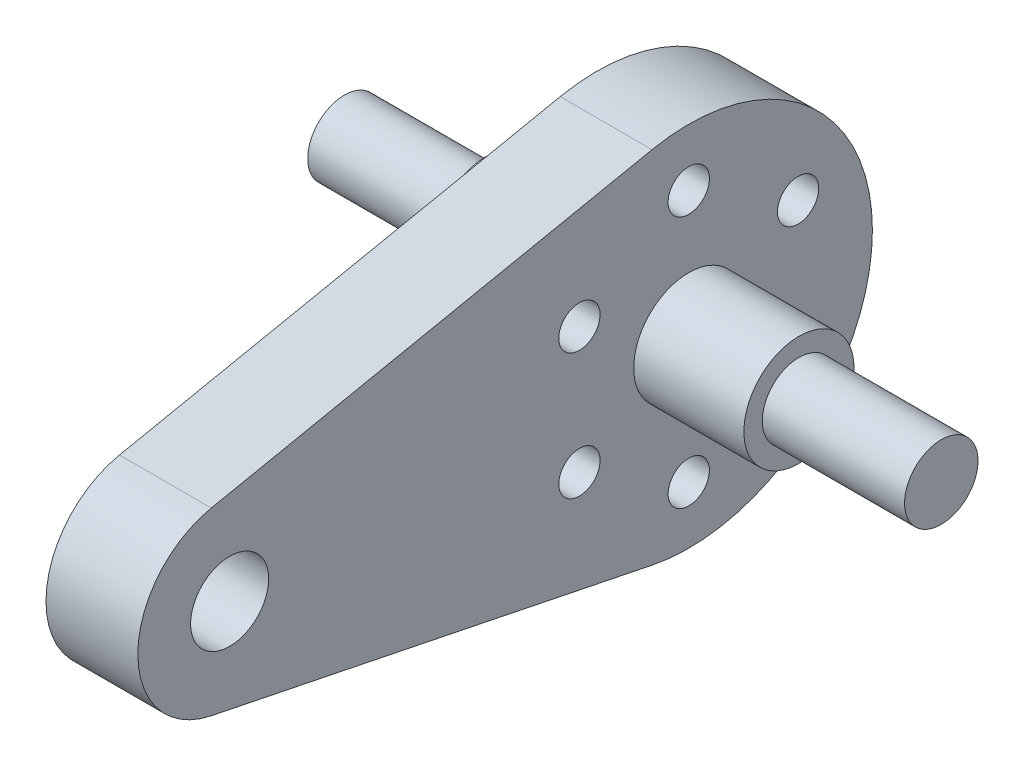
ISO-10303-21;
HEADER;
FILE_DESCRIPTION(('STEP AP214'),'2;1');
FILE_NAME('part.step','',(''),(''),'','','');
FILE_SCHEMA(('AUTOMOTIVE_DESIGN { 1 0 10303 214 1 1 1 1 }'));
ENDSEC;
DATA;
#1=APPLICATION_CONTEXT('core data for automotive mechanical design processes');
#2=APPLICATION_PROTOCOL_DEFINITION('international standard','automotive_design',2000,#1);
#3=PRODUCT_CONTEXT('',#1,'mechanical');
#4=PRODUCT('Part','Part','',(#3));
#5=PRODUCT_RELATED_PRODUCT_CATEGORY('part','',(#4));
#6=PRODUCT_DEFINITION_FORMATION('','',#4);
#7=PRODUCT_DEFINITION_CONTEXT('part definition',#1,'design');
#8=PRODUCT_DEFINITION('design','',#6,#7);
#9=PRODUCT_DEFINITION_SHAPE('','',#8);
#10=(LENGTH_UNIT() NAMED_UNIT(*) SI_UNIT(.MILLI.,.METRE.));
#11=(NAMED_UNIT(*) PLANE_ANGLE_UNIT() SI_UNIT($,.RADIAN.));
#12=(NAMED_UNIT(*) SI_UNIT($,.STERADIAN.) SOLID_ANGLE_UNIT());
#13=UNCERTAINTY_MEASURE_WITH_UNIT(LENGTH_MEASURE(1.E-05),#10,'distance_accuracy_value','');
#14=(GEOMETRIC_REPRESENTATION_CONTEXT(3) GLOBAL_UNCERTAINTY_ASSIGNED_CONTEXT((#13)) GLOBAL_UNIT_ASSIGNED_CONTEXT((#10,
#11,#12)) REPRESENTATION_CONTEXT('',''));
#15=CARTESIAN_POINT('',(0.,0.,0.));
#16=DIRECTION('',(0.,0.,1.));
#17=DIRECTION('',(1.,0.,0.));
#18=AXIS2_PLACEMENT_3D('',#15,#16,#17);
#19=CARTESIAN_POINT('',(32.5,0.,0.));
#20=DIRECTION('',(1.,0.,0.));
#21=DIRECTION('',(0.,0.,-1.));
#22=AXIS2_PLACEMENT_3D('',#19,#20,#21);
#23=CYLINDRICAL_SURFACE('',#22,20.);
#24=CARTESIAN_POINT('',(4.99999999999999,0.,0.));
#25=DIRECTION('',(1.,0.,0.));
#26=DIRECTION('',(0.,0.,-1.));
#27=AXIS2_PLACEMENT_3D('',#24,#25,#26);
#28=CIRCLE('',#27,20.);
#29=CARTESIAN_POINT('',(4.99999999999999,-19.5959179422654,4.));
#30=VERTEX_POINT('',#29);
#31=CARTESIAN_POINT('',(4.99999999999999,19.5959179422654,4.));
#32=VERTEX_POINT('',#31);
#33=EDGE_CURVE('E11',#30,#32,#28,.T.);
#34=ORIENTED_EDGE('',*,*,#33,.F.);
#35=DIRECTION('',(-1.,0.,0.));
#36=VECTOR('',#35,1.);
#37=CARTESIAN_POINT('',(5.,-19.5959179422654,4.00000000000001));
#38=LINE('',#37,#36);
#39=CARTESIAN_POINT('',(-5.,-19.5959179422654,4.));
#40=VERTEX_POINT('',#39);
#41=EDGE_CURVE('E83',#30,#40,#38,.T.);
#42=ORIENTED_EDGE('',*,*,#41,.T.);
#43=CARTESIAN_POINT('',(-5.,0.,0.));
#44=DIRECTION('',(1.,0.,0.));
#45=DIRECTION('',(0.,0.,-1.));
#46=AXIS2_PLACEMENT_3D('',#43,#44,#45);
#47=CIRCLE('',#46,20.);
#48=CARTESIAN_POINT('',(-5.,19.5959179422654,4.));
#49=VERTEX_POINT('',#48);
#50=EDGE_CURVE('E47',#40,#49,#47,.T.);
#51=ORIENTED_EDGE('',*,*,#50,.T.);
#52=DIRECTION('',(-1.,0.,0.));
#53=VECTOR('',#52,1.);
#54=CARTESIAN_POINT('',(5.,19.5959179422654,4.));
#55=LINE('',#54,#53);
#56=EDGE_CURVE('E57',#32,#49,#55,.T.);
#57=ORIENTED_EDGE('',*,*,#56,.F.);
#58=EDGE_LOOP('',(#34,#42,#51,#57));
#59=FACE_BOUND('',#58,.T.);
#60=ADVANCED_FACE('F39',(#59),#23,.T.);
#61=CARTESIAN_POINT('',(5.,20.,0.));
#62=DIRECTION('',(1.,0.,0.));
#63=DIRECTION('',(0.,0.,-1.));
#64=AXIS2_PLACEMENT_3D('',#61,#62,#63);
#65=PLANE('',#64);
#66=CARTESIAN_POINT('',(5.,13.75,0.));
#67=DIRECTION('',(1.,0.,0.));
#68=DIRECTION('',(0.,0.,-1.));
#69=AXIS2_PLACEMENT_3D('',#66,#67,#68);
#70=CIRCLE('',#69,2.25);
#71=CARTESIAN_POINT('',(5.,13.75,-2.25));
#72=VERTEX_POINT('',#71);
#73=EDGE_CURVE('E147',#72,#72,#70,.T.);
#74=ORIENTED_EDGE('',*,*,#73,.F.);
#75=EDGE_LOOP('',(#74));
#76=FACE_BOUND('',#75,.T.);
#77=CARTESIAN_POINT('',(5.,6.87499999999999,11.907849302036));
#78=DIRECTION('',(1.,0.,0.));
#79=DIRECTION('',(0.,0.,-1.));
#80=AXIS2_PLACEMENT_3D('',#77,#78,#79);
#81=CIRCLE('',#80,2.25);
#82=CARTESIAN_POINT('',(5.,6.87499999999999,9.65784930203604));
#83=VERTEX_POINT('',#82);
#84=EDGE_CURVE('E176',#83,#83,#81,.T.);
#85=ORIENTED_EDGE('',*,*,#84,.F.);
#86=EDGE_LOOP('',(#85));
#87=FACE_BOUND('',#86,.T.);
#88=CARTESIAN_POINT('',(5.,-6.87500000000001,11.907849302036));
#89=DIRECTION('',(1.,0.,0.));
#90=DIRECTION('',(0.,0.,-1.));
#91=AXIS2_PLACEMENT_3D('',#88,#89,#90);
#92=CIRCLE('',#91,2.25);
#93=CARTESIAN_POINT('',(5.,-6.87500000000001,9.65784930203603));
#94=VERTEX_POINT('',#93);
#95=EDGE_CURVE('E150',#94,#94,#92,.T.);
#96=ORIENTED_EDGE('',*,*,#95,.F.);
#97=EDGE_LOOP('',(#96));
#98=FACE_BOUND('',#97,.T.);
#99=CARTESIAN_POINT('',(5.,-13.75,0.));
#100=DIRECTION('',(1.,0.,0.));
#101=DIRECTION('',(0.,0.,-1.));
#102=AXIS2_PLACEMENT_3D('',#99,#100,#101);
#103=CIRCLE('',#102,2.25);
#104=CARTESIAN_POINT('',(5.,-13.75,-2.25));
#105=VERTEX_POINT('',#104);
#106=EDGE_CURVE('E157',#105,#105,#103,.T.);
#107=ORIENTED_EDGE('',*,*,#106,.F.);
#108=EDGE_LOOP('',(#107));
#109=FACE_BOUND('',#108,.T.);
#110=CARTESIAN_POINT('',(5.,-6.875,-11.907849302036));
#111=DIRECTION('',(1.,0.,0.));
#112=DIRECTION('',(0.,0.,-1.));
#113=AXIS2_PLACEMENT_3D('',#110,#111,#112);
#114=CIRCLE('',#113,2.25);
#115=CARTESIAN_POINT('',(5.,-6.875,-14.157849302036));
#116=VERTEX_POINT('',#115);
#117=EDGE_CURVE('E163',#116,#116,#114,.T.);
#118=ORIENTED_EDGE('',*,*,#117,.F.);
#119=EDGE_LOOP('',(#118));
#120=FACE_BOUND('',#119,.T.);
#121=CARTESIAN_POINT('',(5.,6.875,-11.907849302036));
#122=DIRECTION('',(1.,0.,0.));
#123=DIRECTION('',(0.,0.,-1.));
#124=AXIS2_PLACEMENT_3D('',#121,#122,#123);
#125=CIRCLE('',#124,2.25);
#126=CARTESIAN_POINT('',(5.,6.875,-14.157849302036));
#127=VERTEX_POINT('',#126);
#128=EDGE_CURVE('E169',#127,#127,#125,.T.);
#129=ORIENTED_EDGE('',*,*,#128,.F.);
#130=EDGE_LOOP('',(#129));
#131=FACE_BOUND('',#130,.T.);
#132=ORIENTED_EDGE('',*,*,#33,.T.);
#133=DIRECTION('',(0.,-0.2,0.979795897113271));
#134=VECTOR('',#133,1.);
#135=CARTESIAN_POINT('',(5.,9.7979589711327,52.));
#136=LINE('',#135,#134);
#137=CARTESIAN_POINT('',(5.,9.7979589711327,52.));
#138=VERTEX_POINT('',#137);
#139=EDGE_CURVE('E85',#32,#138,#136,.T.);
#140=ORIENTED_EDGE('',*,*,#139,.T.);
#141=CARTESIAN_POINT('',(5.,0.,50.));
#142=DIRECTION('',(1.,0.,0.));
#143=DIRECTION('',(0.,0.,-1.));
#144=AXIS2_PLACEMENT_3D('',#141,#142,#143);
#145=CIRCLE('',#144,10.);
#146=CARTESIAN_POINT('',(5.,-9.79795897113272,52.));
#147=VERTEX_POINT('',#146);
#148=EDGE_CURVE('E86',#138,#147,#145,.T.);
#149=ORIENTED_EDGE('',*,*,#148,.T.);
#150=DIRECTION('',(0.,-0.2,-0.979795897113271));
#151=VECTOR('',#150,1.);
#152=CARTESIAN_POINT('',(5.,-9.79795897113272,52.));
#153=LINE('',#152,#151);
#154=EDGE_CURVE('E76',#147,#30,#153,.T.);
#155=ORIENTED_EDGE('',*,*,#154,.T.);
#156=EDGE_LOOP('',(#132,#140,#149,#155));
#157=FACE_BOUND('',#156,.T.);
#158=CARTESIAN_POINT('',(5.,0.,0.));
#159=DIRECTION('',(1.,0.,0.));
#160=DIRECTION('',(0.,0.,-1.));
#161=AXIS2_PLACEMENT_3D('',#158,#159,#160);
#162=CIRCLE('',#161,5.99999999999999);
#163=CARTESIAN_POINT('',(5.,0.,-5.99999999999999));
#164=VERTEX_POINT('',#163);
#165=EDGE_CURVE('E99',#164,#164,#162,.T.);
#166=ORIENTED_EDGE('',*,*,#165,.F.);
#167=EDGE_LOOP('',(#166));
#168=FACE_BOUND('',#167,.T.);
#169=CARTESIAN_POINT('',(5.,0.,50.));
#170=DIRECTION('',(1.,0.,0.));
#171=DIRECTION('',(0.,0.,-1.));
#172=AXIS2_PLACEMENT_3D('',#169,#170,#171);
#173=CIRCLE('',#172,4.25000000000001);
#174=CARTESIAN_POINT('',(5.,0.,45.75));
#175=VERTEX_POINT('',#174);
#176=EDGE_CURVE('E140',#175,#175,#173,.T.);
#177=ORIENTED_EDGE('',*,*,#176,.F.);
#178=EDGE_LOOP('',(#177));
#179=FACE_BOUND('',#178,.T.);
#180=ADVANCED_FACE('F41',(#76,#87,#98,#109,#120,#131,#157,#168,#179),#65,.T.);
#181=CARTESIAN_POINT('',(-5.00000000000001,5.99999999999999,0.));
#182=DIRECTION('',(-1.,0.,0.));
#183=DIRECTION('',(0.,0.,1.));
#184=AXIS2_PLACEMENT_3D('',#181,#182,#183);
#185=PLANE('',#184);
#186=CARTESIAN_POINT('',(-5.00000000000001,13.75,0.));
#187=DIRECTION('',(-1.,0.,0.));
#188=DIRECTION('',(0.,0.,1.));
#189=AXIS2_PLACEMENT_3D('',#186,#187,#188);
#190=CIRCLE('',#189,2.25);
#191=CARTESIAN_POINT('',(-5.00000000000001,13.75,2.25));
#192=VERTEX_POINT('',#191);
#193=EDGE_CURVE('E175',#192,#192,#190,.F.);
#194=ORIENTED_EDGE('',*,*,#193,.T.);
#195=EDGE_LOOP('',(#194));
#196=FACE_BOUND('',#195,.T.);
#197=CARTESIAN_POINT('',(-5.00000000000001,6.87499999999999,11.907849302036));
#198=DIRECTION('',(-1.,0.,0.));
#199=DIRECTION('',(0.,0.,1.));
#200=AXIS2_PLACEMENT_3D('',#197,#198,#199);
#201=CIRCLE('',#200,2.25);
#202=CARTESIAN_POINT('',(-5.00000000000001,6.87499999999999,14.157849302036));
#203=VERTEX_POINT('',#202);
#204=EDGE_CURVE('E154',#203,#203,#201,.F.);
#205=ORIENTED_EDGE('',*,*,#204,.T.);
#206=EDGE_LOOP('',(#205));
#207=FACE_BOUND('',#206,.T.);
#208=CARTESIAN_POINT('',(-5.00000000000001,-6.87500000000001,11.907849302036));
#209=DIRECTION('',(-1.,0.,0.));
#210=DIRECTION('',(0.,0.,1.));
#211=AXIS2_PLACEMENT_3D('',#208,#209,#210);
#212=CIRCLE('',#211,2.25);
#213=CARTESIAN_POINT('',(-5.00000000000001,-6.87500000000001,14.157849302036));
#214=VERTEX_POINT('',#213);
#215=EDGE_CURVE('E153',#214,#214,#212,.F.);
#216=ORIENTED_EDGE('',*,*,#215,.T.);
#217=EDGE_LOOP('',(#216));
#218=FACE_BOUND('',#217,.T.);
#219=CARTESIAN_POINT('',(-5.00000000000001,-13.75,0.));
#220=DIRECTION('',(-1.,0.,0.));
#221=DIRECTION('',(0.,0.,1.));
#222=AXIS2_PLACEMENT_3D('',#219,#220,#221);
#223=CIRCLE('',#222,2.25);
#224=CARTESIAN_POINT('',(-5.00000000000001,-13.75,2.25));
#225=VERTEX_POINT('',#224);
#226=EDGE_CURVE('E160',#225,#225,#223,.F.);
#227=ORIENTED_EDGE('',*,*,#226,.T.);
#228=EDGE_LOOP('',(#227));
#229=FACE_BOUND('',#228,.T.);
#230=CARTESIAN_POINT('',(-5.00000000000001,-6.875,-11.907849302036));
#231=DIRECTION('',(-1.,0.,0.));
#232=DIRECTION('',(0.,0.,1.));
#233=AXIS2_PLACEMENT_3D('',#230,#231,#232);
#234=CIRCLE('',#233,2.25);
#235=CARTESIAN_POINT('',(-5.00000000000001,-6.875,-9.65784930203603));
#236=VERTEX_POINT('',#235);
#237=EDGE_CURVE('E166',#236,#236,#234,.F.);
#238=ORIENTED_EDGE('',*,*,#237,.T.);
#239=EDGE_LOOP('',(#238));
#240=FACE_BOUND('',#239,.T.);
#241=CARTESIAN_POINT('',(-5.00000000000001,6.875,-11.907849302036));
#242=DIRECTION('',(-1.,0.,0.));
#243=DIRECTION('',(0.,0.,1.));
#244=AXIS2_PLACEMENT_3D('',#241,#242,#243);
#245=CIRCLE('',#244,2.25);
#246=CARTESIAN_POINT('',(-5.00000000000001,6.875,-9.65784930203603));
#247=VERTEX_POINT('',#246);
#248=EDGE_CURVE('E172',#247,#247,#245,.F.);
#249=ORIENTED_EDGE('',*,*,#248,.T.);
#250=EDGE_LOOP('',(#249));
#251=FACE_BOUND('',#250,.T.);
#252=CARTESIAN_POINT('',(-5.00000000000001,0.,0.));
#253=DIRECTION('',(1.,0.,0.));
#254=DIRECTION('',(0.,0.,-1.));
#255=AXIS2_PLACEMENT_3D('',#252,#253,#254);
#256=CIRCLE('',#255,5.99999999999999);
#257=CARTESIAN_POINT('',(-5.00000000000001,0.,-5.99999999999999));
#258=VERTEX_POINT('',#257);
#259=EDGE_CURVE('E124',#258,#258,#256,.T.);
#260=ORIENTED_EDGE('',*,*,#259,.T.);
#261=EDGE_LOOP('',(#260));
#262=FACE_BOUND('',#261,.T.);
#263=ORIENTED_EDGE('',*,*,#50,.F.);
#264=DIRECTION('',(0.,-0.2,-0.979795897113271));
#265=VECTOR('',#264,1.);
#266=CARTESIAN_POINT('',(-5.,-9.79795897113272,52.));
#267=LINE('',#266,#265);
#268=CARTESIAN_POINT('',(-5.,-9.79795897113272,52.));
#269=VERTEX_POINT('',#268);
#270=EDGE_CURVE('E134',#269,#40,#267,.T.);
#271=ORIENTED_EDGE('',*,*,#270,.F.);
#272=CARTESIAN_POINT('',(-5.,0.,50.));
#273=DIRECTION('',(1.,0.,0.));
#274=DIRECTION('',(0.,0.,-1.));
#275=AXIS2_PLACEMENT_3D('',#272,#273,#274);
#276=CIRCLE('',#275,10.);
#277=CARTESIAN_POINT('',(-5.,9.7979589711327,52.));
#278=VERTEX_POINT('',#277);
#279=EDGE_CURVE('E98',#278,#269,#276,.T.);
#280=ORIENTED_EDGE('',*,*,#279,.F.);
#281=DIRECTION('',(0.,-0.2,0.979795897113271));
#282=VECTOR('',#281,1.);
#283=CARTESIAN_POINT('',(-5.,9.7979589711327,52.));
#284=LINE('',#283,#282);
#285=EDGE_CURVE('E94',#49,#278,#284,.T.);
#286=ORIENTED_EDGE('',*,*,#285,.F.);
#287=EDGE_LOOP('',(#263,#271,#280,#286));
#288=FACE_BOUND('',#287,.T.);
#289=CARTESIAN_POINT('',(-5.,0.,50.));
#290=DIRECTION('',(1.,0.,0.));
#291=DIRECTION('',(0.,0.,-1.));
#292=AXIS2_PLACEMENT_3D('',#289,#290,#291);
#293=CIRCLE('',#292,4.25000000000001);
#294=CARTESIAN_POINT('',(-5.,0.,45.75));
#295=VERTEX_POINT('',#294);
#296=EDGE_CURVE('E142',#295,#295,#293,.T.);
#297=ORIENTED_EDGE('',*,*,#296,.T.);
#298=EDGE_LOOP('',(#297));
#299=FACE_BOUND('',#298,.T.);
#300=ADVANCED_FACE('F132',(#196,#207,#218,#229,#240,#251,#262,#288,#299),#185,.T.);
#301=CARTESIAN_POINT('',(32.5,0.,0.));
#302=DIRECTION('',(1.,0.,0.));
#303=DIRECTION('',(0.,0.,-1.));
#304=AXIS2_PLACEMENT_3D('',#301,#302,#303);
#305=CYLINDRICAL_SURFACE('',#304,5.99999999999999);
#306=CARTESIAN_POINT('',(-17.,0.,0.));
#307=DIRECTION('',(1.,0.,0.));
#308=DIRECTION('',(0.,0.,-1.));
#309=AXIS2_PLACEMENT_3D('',#306,#307,#308);
#310=CIRCLE('',#309,5.99999999999999);
#311=CARTESIAN_POINT('',(-17.,0.,-5.99999999999999));
#312=VERTEX_POINT('',#311);
#313=EDGE_CURVE('E121',#312,#312,#310,.T.);
#314=ORIENTED_EDGE('',*,*,#313,.T.);
#315=EDGE_LOOP('',(#314));
#316=FACE_BOUND('',#315,.T.);
#317=ORIENTED_EDGE('',*,*,#259,.F.);
#318=EDGE_LOOP('',(#317));
#319=FACE_BOUND('',#318,.T.);
#320=ADVANCED_FACE('F224',(#316,#319),#305,.T.);
#321=CARTESIAN_POINT('',(-17.,3.99999999999999,0.));
#322=DIRECTION('',(-1.,0.,0.));
#323=DIRECTION('',(0.,0.,1.));
#324=AXIS2_PLACEMENT_3D('',#321,#322,#323);
#325=PLANE('',#324);
#326=CARTESIAN_POINT('',(-17.,0.,0.));
#327=DIRECTION('',(1.,0.,0.));
#328=DIRECTION('',(0.,0.,-1.));
#329=AXIS2_PLACEMENT_3D('',#326,#327,#328);
#330=CIRCLE('',#329,3.99999999999999);
#331=CARTESIAN_POINT('',(-17.,0.,-3.99999999999999));
#332=VERTEX_POINT('',#331);
#333=EDGE_CURVE('E118',#332,#332,#330,.T.);
#334=ORIENTED_EDGE('',*,*,#333,.T.);
#335=EDGE_LOOP('',(#334));
#336=FACE_BOUND('',#335,.T.);
#337=ORIENTED_EDGE('',*,*,#313,.F.);
#338=EDGE_LOOP('',(#337));
#339=FACE_BOUND('',#338,.T.);
#340=ADVANCED_FACE('F228',(#336,#339),#325,.T.);
#341=CARTESIAN_POINT('',(32.5,0.,0.));
#342=DIRECTION('',(1.,0.,0.));
#343=DIRECTION('',(0.,0.,-1.));
#344=AXIS2_PLACEMENT_3D('',#341,#342,#343);
#345=CYLINDRICAL_SURFACE('',#344,3.99999999999999);
#346=CARTESIAN_POINT('',(-32.5,0.,0.));
#347=DIRECTION('',(1.,0.,0.));
#348=DIRECTION('',(0.,0.,-1.));
#349=AXIS2_PLACEMENT_3D('',#346,#347,#348);
#350=CIRCLE('',#349,3.99999999999999);
#351=CARTESIAN_POINT('',(-32.5,0.,-3.99999999999999));
#352=VERTEX_POINT('',#351);
#353=EDGE_CURVE('E115',#352,#352,#350,.T.);
#354=ORIENTED_EDGE('',*,*,#353,.T.);
#355=EDGE_LOOP('',(#354));
#356=FACE_BOUND('',#355,.T.);
#357=ORIENTED_EDGE('',*,*,#333,.F.);
#358=EDGE_LOOP('',(#357));
#359=FACE_BOUND('',#358,.T.);
#360=ADVANCED_FACE('F232',(#356,#359),#345,.T.);
#361=CARTESIAN_POINT('',(-32.5,0.,0.));
#362=DIRECTION('',(-1.,0.,0.));
#363=DIRECTION('',(0.,0.,1.));
#364=AXIS2_PLACEMENT_3D('',#361,#362,#363);
#365=PLANE('',#364);
#366=ORIENTED_EDGE('',*,*,#353,.F.);
#367=EDGE_LOOP('',(#366));
#368=FACE_BOUND('',#367,.T.);
#369=ADVANCED_FACE('F236',(#368),#365,.T.);
#370=CARTESIAN_POINT('',(32.5,4.00000000000001,0.));
#371=DIRECTION('',(1.,0.,0.));
#372=DIRECTION('',(0.,0.,-1.));
#373=AXIS2_PLACEMENT_3D('',#370,#371,#372);
#374=PLANE('',#373);
#375=CARTESIAN_POINT('',(32.5,0.,0.));
#376=DIRECTION('',(1.,0.,0.));
#377=DIRECTION('',(0.,0.,-1.));
#378=AXIS2_PLACEMENT_3D('',#375,#376,#377);
#379=CIRCLE('',#378,4.00000000000001);
#380=CARTESIAN_POINT('',(32.5,0.,-4.00000000000001));
#381=VERTEX_POINT('',#380);
#382=EDGE_CURVE('E112',#381,#381,#379,.T.);
#383=ORIENTED_EDGE('',*,*,#382,.T.);
#384=EDGE_LOOP('',(#383));
#385=FACE_BOUND('',#384,.T.);
#386=ADVANCED_FACE('F240',(#385),#374,.T.);
#387=CARTESIAN_POINT('',(32.5,0.,0.));
#388=DIRECTION('',(1.,0.,0.));
#389=DIRECTION('',(0.,0.,-1.));
#390=AXIS2_PLACEMENT_3D('',#387,#388,#389);
#391=CYLINDRICAL_SURFACE('',#390,4.00000000000001);
#392=CARTESIAN_POINT('',(17.,0.,0.));
#393=DIRECTION('',(1.,0.,0.));
#394=DIRECTION('',(0.,0.,-1.));
#395=AXIS2_PLACEMENT_3D('',#392,#393,#394);
#396=CIRCLE('',#395,4.);
#397=CARTESIAN_POINT('',(17.,0.,-4.));
#398=VERTEX_POINT('',#397);
#399=EDGE_CURVE('E109',#398,#398,#396,.T.);
#400=ORIENTED_EDGE('',*,*,#399,.T.);
#401=EDGE_LOOP('',(#400));
#402=FACE_BOUND('',#401,.T.);
#403=ORIENTED_EDGE('',*,*,#382,.F.);
#404=EDGE_LOOP('',(#403));
#405=FACE_BOUND('',#404,.T.);
#406=ADVANCED_FACE('F244',(#402,#405),#391,.T.);
#407=CARTESIAN_POINT('',(17.,6.,0.));
#408=DIRECTION('',(1.,0.,0.));
#409=DIRECTION('',(0.,0.,-1.));
#410=AXIS2_PLACEMENT_3D('',#407,#408,#409);
#411=PLANE('',#410);
#412=CARTESIAN_POINT('',(17.,0.,0.));
#413=DIRECTION('',(1.,0.,0.));
#414=DIRECTION('',(0.,0.,-1.));
#415=AXIS2_PLACEMENT_3D('',#412,#413,#414);
#416=CIRCLE('',#415,6.);
#417=CARTESIAN_POINT('',(17.,0.,-6.));
#418=VERTEX_POINT('',#417);
#419=EDGE_CURVE('E102',#418,#418,#416,.T.);
#420=ORIENTED_EDGE('',*,*,#419,.T.);
#421=EDGE_LOOP('',(#420));
#422=FACE_BOUND('',#421,.T.);
#423=ORIENTED_EDGE('',*,*,#399,.F.);
#424=EDGE_LOOP('',(#423));
#425=FACE_BOUND('',#424,.T.);
#426=ADVANCED_FACE('F248',(#422,#425),#411,.T.);
#427=CARTESIAN_POINT('',(32.5,0.,0.));
#428=DIRECTION('',(1.,0.,0.));
#429=DIRECTION('',(0.,0.,-1.));
#430=AXIS2_PLACEMENT_3D('',#427,#428,#429);
#431=CYLINDRICAL_SURFACE('',#430,6.);
#432=ORIENTED_EDGE('',*,*,#165,.T.);
#433=EDGE_LOOP('',(#432));
#434=FACE_BOUND('',#433,.T.);
#435=ORIENTED_EDGE('',*,*,#419,.F.);
#436=EDGE_LOOP('',(#435));
#437=FACE_BOUND('',#436,.T.);
#438=ADVANCED_FACE('F252',(#434,#437),#431,.T.);
#439=CARTESIAN_POINT('',(5.,0.,50.));
#440=DIRECTION('',(-1.,0.,0.));
#441=DIRECTION('',(0.,0.,1.));
#442=AXIS2_PLACEMENT_3D('',#439,#440,#441);
#443=CYLINDRICAL_SURFACE('',#442,10.);
#444=ORIENTED_EDGE('',*,*,#279,.T.);
#445=DIRECTION('',(-1.,0.,0.));
#446=VECTOR('',#445,1.);
#447=CARTESIAN_POINT('',(5.,-9.79795897113272,52.));
#448=LINE('',#447,#446);
#449=EDGE_CURVE('E81',#147,#269,#448,.T.);
#450=ORIENTED_EDGE('',*,*,#449,.F.);
#451=ORIENTED_EDGE('',*,*,#148,.F.);
#452=DIRECTION('',(-1.,0.,0.));
#453=VECTOR('',#452,1.);
#454=CARTESIAN_POINT('',(5.,9.7979589711327,52.));
#455=LINE('',#454,#453);
#456=EDGE_CURVE('E131',#138,#278,#455,.T.);
#457=ORIENTED_EDGE('',*,*,#456,.T.);
#458=EDGE_LOOP('',(#444,#450,#451,#457));
#459=FACE_BOUND('',#458,.T.);
#460=ADVANCED_FACE('F96',(#459),#443,.T.);
#461=CARTESIAN_POINT('',(5.,-9.79795897113272,52.));
#462=DIRECTION('',(0.,0.979795897113271,-0.2));
#463=DIRECTION('',(0.,0.2,0.979795897113271));
#464=AXIS2_PLACEMENT_3D('',#461,#462,#463);
#465=PLANE('',#464);
#466=ORIENTED_EDGE('',*,*,#270,.T.);
#467=ORIENTED_EDGE('',*,*,#41,.F.);
#468=ORIENTED_EDGE('',*,*,#154,.F.);
#469=ORIENTED_EDGE('',*,*,#449,.T.);
#470=EDGE_LOOP('',(#466,#467,#468,#469));
#471=FACE_BOUND('',#470,.T.);
#472=ADVANCED_FACE('F79',(#471),#465,.F.);
#473=CARTESIAN_POINT('',(5.,9.7979589711327,52.));
#474=DIRECTION('',(0.,-0.979795897113271,-0.2));
#475=DIRECTION('',(0.,0.2,-0.979795897113271));
#476=AXIS2_PLACEMENT_3D('',#473,#474,#475);
#477=PLANE('',#476);
#478=ORIENTED_EDGE('',*,*,#285,.T.);
#479=ORIENTED_EDGE('',*,*,#456,.F.);
#480=ORIENTED_EDGE('',*,*,#139,.F.);
#481=ORIENTED_EDGE('',*,*,#56,.T.);
#482=EDGE_LOOP('',(#478,#479,#480,#481));
#483=FACE_BOUND('',#482,.T.);
#484=ADVANCED_FACE('F130',(#483),#477,.F.);
#485=CARTESIAN_POINT('',(5.,0.,50.));
#486=DIRECTION('',(-1.,0.,0.));
#487=DIRECTION('',(0.,0.,1.));
#488=AXIS2_PLACEMENT_3D('',#485,#486,#487);
#489=CYLINDRICAL_SURFACE('',#488,4.25000000000001);
#490=ORIENTED_EDGE('',*,*,#176,.T.);
#491=EDGE_LOOP('',(#490));
#492=FACE_BOUND('',#491,.T.);
#493=ORIENTED_EDGE('',*,*,#296,.F.);
#494=EDGE_LOOP('',(#493));
#495=FACE_BOUND('',#494,.T.);
#496=ADVANCED_FACE('F203',(#492,#495),#489,.F.);
#497=CARTESIAN_POINT('',(-32.501,6.875,-11.907849302036));
#498=DIRECTION('',(1.,0.,0.));
#499=DIRECTION('',(0.,0.,-1.));
#500=AXIS2_PLACEMENT_3D('',#497,#498,#499);
#501=CYLINDRICAL_SURFACE('',#500,2.25);
#502=ORIENTED_EDGE('',*,*,#248,.F.);
#503=EDGE_LOOP('',(#502));
#504=FACE_BOUND('',#503,.T.);
#505=ORIENTED_EDGE('',*,*,#128,.T.);
#506=EDGE_LOOP('',(#505));
#507=FACE_BOUND('',#506,.T.);
#508=ADVANCED_FACE('F200',(#504,#507),#501,.F.);
#509=CARTESIAN_POINT('',(-32.501,-6.875,-11.907849302036));
#510=DIRECTION('',(1.,0.,0.));
#511=DIRECTION('',(0.,0.,-1.));
#512=AXIS2_PLACEMENT_3D('',#509,#510,#511);
#513=CYLINDRICAL_SURFACE('',#512,2.25);
#514=ORIENTED_EDGE('',*,*,#237,.F.);
#515=EDGE_LOOP('',(#514));
#516=FACE_BOUND('',#515,.T.);
#517=ORIENTED_EDGE('',*,*,#117,.T.);
#518=EDGE_LOOP('',(#517));
#519=FACE_BOUND('',#518,.T.);
#520=ADVANCED_FACE('F202',(#516,#519),#513,.F.);
#521=CARTESIAN_POINT('',(-32.501,-13.75,0.));
#522=DIRECTION('',(1.,0.,0.));
#523=DIRECTION('',(0.,0.,-1.));
#524=AXIS2_PLACEMENT_3D('',#521,#522,#523);
#525=CYLINDRICAL_SURFACE('',#524,2.25);
#526=ORIENTED_EDGE('',*,*,#226,.F.);
#527=EDGE_LOOP('',(#526));
#528=FACE_BOUND('',#527,.T.);
#529=ORIENTED_EDGE('',*,*,#106,.T.);
#530=EDGE_LOOP('',(#529));
#531=FACE_BOUND('',#530,.T.);
#532=ADVANCED_FACE('F210',(#528,#531),#525,.F.);
#533=CARTESIAN_POINT('',(-32.501,-6.87500000000001,11.907849302036));
#534=DIRECTION('',(1.,0.,0.));
#535=DIRECTION('',(0.,0.,-1.));
#536=AXIS2_PLACEMENT_3D('',#533,#534,#535);
#537=CYLINDRICAL_SURFACE('',#536,2.25);
#538=ORIENTED_EDGE('',*,*,#215,.F.);
#539=EDGE_LOOP('',(#538));
#540=FACE_BOUND('',#539,.T.);
#541=ORIENTED_EDGE('',*,*,#95,.T.);
#542=EDGE_LOOP('',(#541));
#543=FACE_BOUND('',#542,.T.);
#544=ADVANCED_FACE('F261',(#540,#543),#537,.F.);
#545=CARTESIAN_POINT('',(-32.501,6.87499999999999,11.907849302036));
#546=DIRECTION('',(1.,0.,0.));
#547=DIRECTION('',(0.,0.,-1.));
#548=AXIS2_PLACEMENT_3D('',#545,#546,#547);
#549=CYLINDRICAL_SURFACE('',#548,2.25);
#550=ORIENTED_EDGE('',*,*,#204,.F.);
#551=EDGE_LOOP('',(#550));
#552=FACE_BOUND('',#551,.T.);
#553=ORIENTED_EDGE('',*,*,#84,.T.);
#554=EDGE_LOOP('',(#553));
#555=FACE_BOUND('',#554,.T.);
#556=ADVANCED_FACE('F264',(#552,#555),#549,.F.);
#557=CARTESIAN_POINT('',(-32.501,13.75,0.));
#558=DIRECTION('',(1.,0.,0.));
#559=DIRECTION('',(0.,0.,-1.));
#560=AXIS2_PLACEMENT_3D('',#557,#558,#559);
#561=CYLINDRICAL_SURFACE('',#560,2.25);
#562=ORIENTED_EDGE('',*,*,#193,.F.);
#563=EDGE_LOOP('',(#562));
#564=FACE_BOUND('',#563,.T.);
#565=ORIENTED_EDGE('',*,*,#73,.T.);
#566=EDGE_LOOP('',(#565));
#567=FACE_BOUND('',#566,.T.);
#568=ADVANCED_FACE('F186',(#564,#567),#561,.F.);
#569=CLOSED_SHELL('',(#60,#180,#300,#320,#340,#360,#369,#386,#406,#426,#438,#460,#472,#484,#496,
#508,#520,#532,#544,#556,#568));
#570=MANIFOLD_SOLID_BREP('B2',#569);
#571=ADVANCED_BREP_SHAPE_REPRESENTATION('',(#18,#570),#14);
#572=SHAPE_DEFINITION_REPRESENTATION(#9,#571);
ENDSEC;
END-ISO-10303-21;
